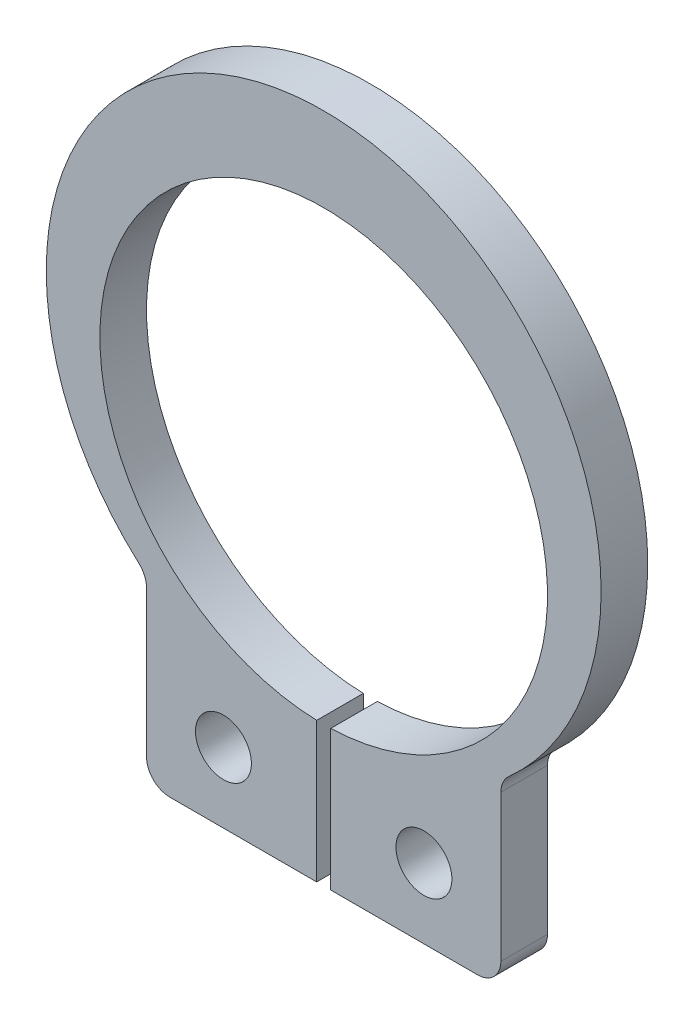
ISO-10303-21;
HEADER;
FILE_DESCRIPTION(('STEP AP214'),'2;1');
FILE_NAME('part.step','',(''),(''),'','','');
FILE_SCHEMA(('AUTOMOTIVE_DESIGN { 1 0 10303 214 1 1 1 1 }'));
ENDSEC;
DATA;
#1=APPLICATION_CONTEXT('core data for automotive mechanical design processes');
#2=APPLICATION_PROTOCOL_DEFINITION('international standard','automotive_design',2000,#1);
#3=PRODUCT_CONTEXT('',#1,'mechanical');
#4=PRODUCT('Part','Part','',(#3));
#5=PRODUCT_RELATED_PRODUCT_CATEGORY('part','',(#4));
#6=PRODUCT_DEFINITION_FORMATION('','',#4);
#7=PRODUCT_DEFINITION_CONTEXT('part definition',#1,'design');
#8=PRODUCT_DEFINITION('design','',#6,#7);
#9=PRODUCT_DEFINITION_SHAPE('','',#8);
#10=(LENGTH_UNIT() NAMED_UNIT(*) SI_UNIT(.MILLI.,.METRE.));
#11=(NAMED_UNIT(*) PLANE_ANGLE_UNIT() SI_UNIT($,.RADIAN.));
#12=(NAMED_UNIT(*) SI_UNIT($,.STERADIAN.) SOLID_ANGLE_UNIT());
#13=UNCERTAINTY_MEASURE_WITH_UNIT(LENGTH_MEASURE(1.E-05),#10,'distance_accuracy_value','');
#14=(GEOMETRIC_REPRESENTATION_CONTEXT(3) GLOBAL_UNCERTAINTY_ASSIGNED_CONTEXT((#13)) GLOBAL_UNIT_ASSIGNED_CONTEXT((#10,
#11,#12)) REPRESENTATION_CONTEXT('',''));
#15=CARTESIAN_POINT('',(0.,0.,0.));
#16=DIRECTION('',(0.,0.,1.));
#17=DIRECTION('',(1.,0.,0.));
#18=AXIS2_PLACEMENT_3D('',#15,#16,#17);
#19=CARTESIAN_POINT('',(4.3,-4.15754615162455,-1.));
#20=DIRECTION('',(0.,0.,1.));
#21=DIRECTION('',(1.,0.,0.));
#22=AXIS2_PLACEMENT_3D('',#19,#20,#21);
#23=CYLINDRICAL_SURFACE('',#22,0.5);
#24=CARTESIAN_POINT('',(4.3,-4.15754615162455,0.));
#25=DIRECTION('',(0.,0.,-1.));
#26=DIRECTION('',(-1.,0.,0.));
#27=AXIS2_PLACEMENT_3D('',#24,#25,#26);
#28=CIRCLE('',#27,0.5);
#29=CARTESIAN_POINT('',(3.8,-4.15754615162455,0.));
#30=VERTEX_POINT('',#29);
#31=CARTESIAN_POINT('',(3.96666666666667,-3.78486815537458,0.));
#32=VERTEX_POINT('',#31);
#33=EDGE_CURVE('E154',#30,#32,#28,.T.);
#34=ORIENTED_EDGE('',*,*,#33,.F.);
#35=DIRECTION('',(0.,0.,1.));
#36=VECTOR('',#35,1.);
#37=CARTESIAN_POINT('',(3.8,-4.15754615162455,-1.));
#38=LINE('',#37,#36);
#39=CARTESIAN_POINT('',(3.8,-4.15754615162455,-1.));
#40=VERTEX_POINT('',#39);
#41=EDGE_CURVE('E11',#40,#30,#38,.T.);
#42=ORIENTED_EDGE('',*,*,#41,.F.);
#43=CARTESIAN_POINT('',(4.3,-4.15754615162455,-1.));
#44=DIRECTION('',(0.,0.,-1.));
#45=DIRECTION('',(-1.,0.,0.));
#46=AXIS2_PLACEMENT_3D('',#43,#44,#45);
#47=CIRCLE('',#46,0.5);
#48=CARTESIAN_POINT('',(3.96666666666667,-3.78486815537458,-1.));
#49=VERTEX_POINT('',#48);
#50=EDGE_CURVE('E187',#40,#49,#47,.T.);
#51=ORIENTED_EDGE('',*,*,#50,.T.);
#52=DIRECTION('',(0.,0.,1.));
#53=VECTOR('',#52,1.);
#54=CARTESIAN_POINT('',(3.96666666666667,-3.78486815537458,-1.));
#55=LINE('',#54,#53);
#56=EDGE_CURVE('E36',#49,#32,#55,.T.);
#57=ORIENTED_EDGE('',*,*,#56,.T.);
#58=EDGE_LOOP('',(#34,#42,#51,#57));
#59=FACE_BOUND('',#58,.T.);
#60=ADVANCED_FACE('F33',(#59),#23,.F.);
#61=CARTESIAN_POINT('',(3.8,-7.3,-1.));
#62=DIRECTION('',(1.,0.,0.));
#63=DIRECTION('',(0.,0.,-1.));
#64=AXIS2_PLACEMENT_3D('',#61,#62,#63);
#65=PLANE('',#64);
#66=DIRECTION('',(0.,1.,0.));
#67=VECTOR('',#66,1.);
#68=CARTESIAN_POINT('',(3.8,-7.3,0.));
#69=LINE('',#68,#67);
#70=CARTESIAN_POINT('',(3.8,-7.3,0.));
#71=VERTEX_POINT('',#70);
#72=EDGE_CURVE('E185',#71,#30,#69,.T.);
#73=ORIENTED_EDGE('',*,*,#72,.F.);
#74=DIRECTION('',(0.,0.,1.));
#75=VECTOR('',#74,1.);
#76=CARTESIAN_POINT('',(3.8,-7.3,-1.));
#77=LINE('',#76,#75);
#78=CARTESIAN_POINT('',(3.8,-7.3,-1.));
#79=VERTEX_POINT('',#78);
#80=EDGE_CURVE('E42',#79,#71,#77,.T.);
#81=ORIENTED_EDGE('',*,*,#80,.F.);
#82=DIRECTION('',(0.,1.,0.));
#83=VECTOR('',#82,1.);
#84=CARTESIAN_POINT('',(3.8,-7.3,-1.));
#85=LINE('',#84,#83);
#86=EDGE_CURVE('E144',#79,#40,#85,.T.);
#87=ORIENTED_EDGE('',*,*,#86,.T.);
#88=ORIENTED_EDGE('',*,*,#41,.T.);
#89=EDGE_LOOP('',(#73,#81,#87,#88));
#90=FACE_BOUND('',#89,.T.);
#91=ADVANCED_FACE('F207',(#90),#65,.T.);
#92=CARTESIAN_POINT('',(3.3,-7.3,-1.));
#93=DIRECTION('',(0.,0.,1.));
#94=DIRECTION('',(1.,0.,0.));
#95=AXIS2_PLACEMENT_3D('',#92,#93,#94);
#96=CYLINDRICAL_SURFACE('',#95,0.5);
#97=CARTESIAN_POINT('',(3.3,-7.3,0.));
#98=DIRECTION('',(0.,0.,1.));
#99=DIRECTION('',(1.,0.,0.));
#100=AXIS2_PLACEMENT_3D('',#97,#98,#99);
#101=CIRCLE('',#100,0.5);
#102=CARTESIAN_POINT('',(3.3,-7.8,0.));
#103=VERTEX_POINT('',#102);
#104=EDGE_CURVE('E131',#103,#71,#101,.T.);
#105=ORIENTED_EDGE('',*,*,#104,.F.);
#106=DIRECTION('',(0.,0.,1.));
#107=VECTOR('',#106,1.);
#108=CARTESIAN_POINT('',(3.3,-7.8,-1.));
#109=LINE('',#108,#107);
#110=CARTESIAN_POINT('',(3.3,-7.8,-1.));
#111=VERTEX_POINT('',#110);
#112=EDGE_CURVE('E126',#111,#103,#109,.T.);
#113=ORIENTED_EDGE('',*,*,#112,.F.);
#114=CARTESIAN_POINT('',(3.3,-7.3,-1.));
#115=DIRECTION('',(0.,0.,1.));
#116=DIRECTION('',(1.,0.,0.));
#117=AXIS2_PLACEMENT_3D('',#114,#115,#116);
#118=CIRCLE('',#117,0.5);
#119=EDGE_CURVE('E129',#111,#79,#118,.T.);
#120=ORIENTED_EDGE('',*,*,#119,.T.);
#121=ORIENTED_EDGE('',*,*,#80,.T.);
#122=EDGE_LOOP('',(#105,#113,#120,#121));
#123=FACE_BOUND('',#122,.T.);
#124=ADVANCED_FACE('F128',(#123),#96,.T.);
#125=CARTESIAN_POINT('',(0.15,-7.8,-1.));
#126=DIRECTION('',(0.,-1.,0.));
#127=DIRECTION('',(0.,0.,-1.));
#128=AXIS2_PLACEMENT_3D('',#125,#126,#127);
#129=PLANE('',#128);
#130=DIRECTION('',(1.,0.,0.));
#131=VECTOR('',#130,1.);
#132=CARTESIAN_POINT('',(0.15,-7.8,0.));
#133=LINE('',#132,#131);
#134=CARTESIAN_POINT('',(0.15,-7.8,0.));
#135=VERTEX_POINT('',#134);
#136=EDGE_CURVE('E182',#135,#103,#133,.T.);
#137=ORIENTED_EDGE('',*,*,#136,.F.);
#138=DIRECTION('',(0.,0.,1.));
#139=VECTOR('',#138,1.);
#140=CARTESIAN_POINT('',(0.15,-7.8,-1.));
#141=LINE('',#140,#139);
#142=CARTESIAN_POINT('',(0.15,-7.8,-1.));
#143=VERTEX_POINT('',#142);
#144=EDGE_CURVE('E136',#143,#135,#141,.T.);
#145=ORIENTED_EDGE('',*,*,#144,.F.);
#146=DIRECTION('',(1.,0.,0.));
#147=VECTOR('',#146,1.);
#148=CARTESIAN_POINT('',(0.15,-7.8,-1.));
#149=LINE('',#148,#147);
#150=EDGE_CURVE('E142',#143,#111,#149,.T.);
#151=ORIENTED_EDGE('',*,*,#150,.T.);
#152=ORIENTED_EDGE('',*,*,#112,.T.);
#153=EDGE_LOOP('',(#137,#145,#151,#152));
#154=FACE_BOUND('',#153,.T.);
#155=ADVANCED_FACE('F146',(#154),#129,.T.);
#156=CARTESIAN_POINT('',(0.15,-4.79765567751584,-1.));
#157=DIRECTION('',(-1.,0.,0.));
#158=DIRECTION('',(0.,-1.,0.));
#159=AXIS2_PLACEMENT_3D('',#156,#157,#158);
#160=PLANE('',#159);
#161=DIRECTION('',(0.,-1.,0.));
#162=VECTOR('',#161,1.);
#163=CARTESIAN_POINT('',(0.15,-4.79765567751584,0.));
#164=LINE('',#163,#162);
#165=CARTESIAN_POINT('',(0.150000000000003,-4.79765567751584,0.));
#166=VERTEX_POINT('',#165);
#167=EDGE_CURVE('E179',#166,#135,#164,.T.);
#168=ORIENTED_EDGE('',*,*,#167,.F.);
#169=DIRECTION('',(0.,0.,1.));
#170=VECTOR('',#169,1.);
#171=CARTESIAN_POINT('',(0.150000000000003,-4.79765567751584,-1.));
#172=LINE('',#171,#170);
#173=CARTESIAN_POINT('',(0.150000000000003,-4.79765567751584,-1.));
#174=VERTEX_POINT('',#173);
#175=EDGE_CURVE('E191',#174,#166,#172,.T.);
#176=ORIENTED_EDGE('',*,*,#175,.F.);
#177=DIRECTION('',(0.,-1.,0.));
#178=VECTOR('',#177,1.);
#179=CARTESIAN_POINT('',(0.15,-4.79765567751584,-1.));
#180=LINE('',#179,#178);
#181=EDGE_CURVE('E147',#174,#143,#180,.T.);
#182=ORIENTED_EDGE('',*,*,#181,.T.);
#183=ORIENTED_EDGE('',*,*,#144,.T.);
#184=EDGE_LOOP('',(#168,#176,#182,#183));
#185=FACE_BOUND('',#184,.T.);
#186=ADVANCED_FACE('F220',(#185),#160,.T.);
#187=CARTESIAN_POINT('',(0.,0.,-1.));
#188=DIRECTION('',(0.,0.,1.));
#189=DIRECTION('',(1.,0.,0.));
#190=AXIS2_PLACEMENT_3D('',#187,#188,#189);
#191=CYLINDRICAL_SURFACE('',#190,4.80000000000002);
#192=CARTESIAN_POINT('',(0.,0.,0.));
#193=DIRECTION('',(0.,0.,-1.));
#194=DIRECTION('',(-1.,0.,0.));
#195=AXIS2_PLACEMENT_3D('',#192,#193,#194);
#196=CIRCLE('',#195,4.80000000000002);
#197=CARTESIAN_POINT('',(-0.15,-4.79765567751584,0.));
#198=VERTEX_POINT('',#197);
#199=EDGE_CURVE('E176',#198,#166,#196,.T.);
#200=ORIENTED_EDGE('',*,*,#199,.F.);
#201=DIRECTION('',(0.,0.,1.));
#202=VECTOR('',#201,1.);
#203=CARTESIAN_POINT('',(-0.15,-4.79765567751584,-1.));
#204=LINE('',#203,#202);
#205=CARTESIAN_POINT('',(-0.15,-4.79765567751584,-1.));
#206=VERTEX_POINT('',#205);
#207=EDGE_CURVE('E193',#206,#198,#204,.T.);
#208=ORIENTED_EDGE('',*,*,#207,.F.);
#209=CARTESIAN_POINT('',(0.,0.,-1.));
#210=DIRECTION('',(0.,0.,-1.));
#211=DIRECTION('',(-1.,0.,0.));
#212=AXIS2_PLACEMENT_3D('',#209,#210,#211);
#213=CIRCLE('',#212,4.80000000000002);
#214=EDGE_CURVE('E149',#206,#174,#213,.T.);
#215=ORIENTED_EDGE('',*,*,#214,.T.);
#216=ORIENTED_EDGE('',*,*,#175,.T.);
#217=EDGE_LOOP('',(#200,#208,#215,#216));
#218=FACE_BOUND('',#217,.T.);
#219=ADVANCED_FACE('F223',(#218),#191,.F.);
#220=CARTESIAN_POINT('',(-0.15,-7.8,-1.));
#221=DIRECTION('',(1.,0.,0.));
#222=DIRECTION('',(0.,1.,0.));
#223=AXIS2_PLACEMENT_3D('',#220,#221,#222);
#224=PLANE('',#223);
#225=DIRECTION('',(0.,1.,0.));
#226=VECTOR('',#225,1.);
#227=CARTESIAN_POINT('',(-0.15,-7.8,0.));
#228=LINE('',#227,#226);
#229=CARTESIAN_POINT('',(-0.15,-7.8,0.));
#230=VERTEX_POINT('',#229);
#231=EDGE_CURVE('E173',#230,#198,#228,.T.);
#232=ORIENTED_EDGE('',*,*,#231,.F.);
#233=DIRECTION('',(0.,0.,1.));
#234=VECTOR('',#233,1.);
#235=CARTESIAN_POINT('',(-0.15,-7.8,-1.));
#236=LINE('',#235,#234);
#237=CARTESIAN_POINT('',(-0.15,-7.8,-1.));
#238=VERTEX_POINT('',#237);
#239=EDGE_CURVE('E195',#238,#230,#236,.T.);
#240=ORIENTED_EDGE('',*,*,#239,.F.);
#241=DIRECTION('',(0.,1.,0.));
#242=VECTOR('',#241,1.);
#243=CARTESIAN_POINT('',(-0.15,-7.8,-1.));
#244=LINE('',#243,#242);
#245=EDGE_CURVE('E297',#238,#206,#244,.T.);
#246=ORIENTED_EDGE('',*,*,#245,.T.);
#247=ORIENTED_EDGE('',*,*,#207,.T.);
#248=EDGE_LOOP('',(#232,#240,#246,#247));
#249=FACE_BOUND('',#248,.T.);
#250=ADVANCED_FACE('F227',(#249),#224,.T.);
#251=CARTESIAN_POINT('',(-3.3,-7.8,-1.));
#252=DIRECTION('',(0.,-1.,0.));
#253=DIRECTION('',(0.,0.,-1.));
#254=AXIS2_PLACEMENT_3D('',#251,#252,#253);
#255=PLANE('',#254);
#256=DIRECTION('',(1.,0.,0.));
#257=VECTOR('',#256,1.);
#258=CARTESIAN_POINT('',(-3.3,-7.8,0.));
#259=LINE('',#258,#257);
#260=CARTESIAN_POINT('',(-3.3,-7.8,0.));
#261=VERTEX_POINT('',#260);
#262=EDGE_CURVE('E170',#261,#230,#259,.T.);
#263=ORIENTED_EDGE('',*,*,#262,.F.);
#264=DIRECTION('',(0.,0.,1.));
#265=VECTOR('',#264,1.);
#266=CARTESIAN_POINT('',(-3.3,-7.8,-1.));
#267=LINE('',#266,#265);
#268=CARTESIAN_POINT('',(-3.3,-7.8,-1.));
#269=VERTEX_POINT('',#268);
#270=EDGE_CURVE('E197',#269,#261,#267,.T.);
#271=ORIENTED_EDGE('',*,*,#270,.F.);
#272=DIRECTION('',(1.,0.,0.));
#273=VECTOR('',#272,1.);
#274=CARTESIAN_POINT('',(-3.3,-7.8,-1.));
#275=LINE('',#274,#273);
#276=EDGE_CURVE('E294',#269,#238,#275,.T.);
#277=ORIENTED_EDGE('',*,*,#276,.T.);
#278=ORIENTED_EDGE('',*,*,#239,.T.);
#279=EDGE_LOOP('',(#263,#271,#277,#278));
#280=FACE_BOUND('',#279,.T.);
#281=ADVANCED_FACE('F231',(#280),#255,.T.);
#282=CARTESIAN_POINT('',(-3.3,-7.3,-1.));
#283=DIRECTION('',(0.,0.,1.));
#284=DIRECTION('',(1.,0.,0.));
#285=AXIS2_PLACEMENT_3D('',#282,#283,#284);
#286=CYLINDRICAL_SURFACE('',#285,0.5);
#287=CARTESIAN_POINT('',(-3.3,-7.3,0.));
#288=DIRECTION('',(0.,0.,1.));
#289=DIRECTION('',(1.,0.,0.));
#290=AXIS2_PLACEMENT_3D('',#287,#288,#289);
#291=CIRCLE('',#290,0.5);
#292=CARTESIAN_POINT('',(-3.8,-7.3,0.));
#293=VERTEX_POINT('',#292);
#294=EDGE_CURVE('E167',#293,#261,#291,.T.);
#295=ORIENTED_EDGE('',*,*,#294,.F.);
#296=DIRECTION('',(0.,0.,1.));
#297=VECTOR('',#296,1.);
#298=CARTESIAN_POINT('',(-3.8,-7.3,-1.));
#299=LINE('',#298,#297);
#300=CARTESIAN_POINT('',(-3.8,-7.3,-1.));
#301=VERTEX_POINT('',#300);
#302=EDGE_CURVE('E199',#301,#293,#299,.T.);
#303=ORIENTED_EDGE('',*,*,#302,.F.);
#304=CARTESIAN_POINT('',(-3.3,-7.3,-1.));
#305=DIRECTION('',(0.,0.,1.));
#306=DIRECTION('',(1.,0.,0.));
#307=AXIS2_PLACEMENT_3D('',#304,#305,#306);
#308=CIRCLE('',#307,0.5);
#309=EDGE_CURVE('E291',#301,#269,#308,.T.);
#310=ORIENTED_EDGE('',*,*,#309,.T.);
#311=ORIENTED_EDGE('',*,*,#270,.T.);
#312=EDGE_LOOP('',(#295,#303,#310,#311));
#313=FACE_BOUND('',#312,.T.);
#314=ADVANCED_FACE('F235',(#313),#286,.T.);
#315=CARTESIAN_POINT('',(-3.8,-4.15754615162455,-1.));
#316=DIRECTION('',(-1.,0.,0.));
#317=DIRECTION('',(0.,0.,1.));
#318=AXIS2_PLACEMENT_3D('',#315,#316,#317);
#319=PLANE('',#318);
#320=DIRECTION('',(0.,-1.,0.));
#321=VECTOR('',#320,1.);
#322=CARTESIAN_POINT('',(-3.8,-4.15754615162455,0.));
#323=LINE('',#322,#321);
#324=CARTESIAN_POINT('',(-3.8,-4.15754615162455,0.));
#325=VERTEX_POINT('',#324);
#326=EDGE_CURVE('E164',#325,#293,#323,.T.);
#327=ORIENTED_EDGE('',*,*,#326,.F.);
#328=DIRECTION('',(0.,0.,1.));
#329=VECTOR('',#328,1.);
#330=CARTESIAN_POINT('',(-3.8,-4.15754615162455,-1.));
#331=LINE('',#330,#329);
#332=CARTESIAN_POINT('',(-3.8,-4.15754615162455,-1.));
#333=VERTEX_POINT('',#332);
#334=EDGE_CURVE('E201',#333,#325,#331,.T.);
#335=ORIENTED_EDGE('',*,*,#334,.F.);
#336=DIRECTION('',(0.,-1.,0.));
#337=VECTOR('',#336,1.);
#338=CARTESIAN_POINT('',(-3.8,-4.15754615162455,-1.));
#339=LINE('',#338,#337);
#340=EDGE_CURVE('E288',#333,#301,#339,.T.);
#341=ORIENTED_EDGE('',*,*,#340,.T.);
#342=ORIENTED_EDGE('',*,*,#302,.T.);
#343=EDGE_LOOP('',(#327,#335,#341,#342));
#344=FACE_BOUND('',#343,.T.);
#345=ADVANCED_FACE('F239',(#344),#319,.T.);
#346=CARTESIAN_POINT('',(-4.3,-4.15754615162455,-1.));
#347=DIRECTION('',(0.,0.,1.));
#348=DIRECTION('',(1.,0.,0.));
#349=AXIS2_PLACEMENT_3D('',#346,#347,#348);
#350=CYLINDRICAL_SURFACE('',#349,0.5);
#351=CARTESIAN_POINT('',(-4.3,-4.15754615162455,0.));
#352=DIRECTION('',(0.,0.,-1.));
#353=DIRECTION('',(-1.,0.,0.));
#354=AXIS2_PLACEMENT_3D('',#351,#352,#353);
#355=CIRCLE('',#354,0.5);
#356=CARTESIAN_POINT('',(-3.96666666666667,-3.78486815537458,0.));
#357=VERTEX_POINT('',#356);
#358=EDGE_CURVE('E161',#357,#325,#355,.T.);
#359=ORIENTED_EDGE('',*,*,#358,.F.);
#360=DIRECTION('',(0.,0.,1.));
#361=VECTOR('',#360,1.);
#362=CARTESIAN_POINT('',(-3.96666666666667,-3.78486815537458,-1.));
#363=LINE('',#362,#361);
#364=CARTESIAN_POINT('',(-3.96666666666667,-3.78486815537458,-1.));
#365=VERTEX_POINT('',#364);
#366=EDGE_CURVE('E202',#365,#357,#363,.T.);
#367=ORIENTED_EDGE('',*,*,#366,.F.);
#368=CARTESIAN_POINT('',(-4.3,-4.15754615162455,-1.));
#369=DIRECTION('',(0.,0.,-1.));
#370=DIRECTION('',(-1.,0.,0.));
#371=AXIS2_PLACEMENT_3D('',#368,#369,#370);
#372=CIRCLE('',#371,0.5);
#373=EDGE_CURVE('E285',#365,#333,#372,.T.);
#374=ORIENTED_EDGE('',*,*,#373,.T.);
#375=ORIENTED_EDGE('',*,*,#334,.T.);
#376=EDGE_LOOP('',(#359,#367,#374,#375));
#377=FACE_BOUND('',#376,.T.);
#378=ADVANCED_FACE('F243',(#377),#350,.F.);
#379=CARTESIAN_POINT('',(0.,0.65,-1.));
#380=DIRECTION('',(0.,0.,1.));
#381=DIRECTION('',(1.,0.,0.));
#382=AXIS2_PLACEMENT_3D('',#379,#380,#381);
#383=CYLINDRICAL_SURFACE('',#382,5.95);
#384=CARTESIAN_POINT('',(0.,0.65,0.));
#385=DIRECTION('',(0.,0.,1.));
#386=DIRECTION('',(1.,0.,0.));
#387=AXIS2_PLACEMENT_3D('',#384,#385,#386);
#388=CIRCLE('',#387,5.95);
#389=EDGE_CURVE('E157',#32,#357,#388,.T.);
#390=ORIENTED_EDGE('',*,*,#389,.F.);
#391=ORIENTED_EDGE('',*,*,#56,.F.);
#392=CARTESIAN_POINT('',(0.,0.65,-1.));
#393=DIRECTION('',(0.,0.,1.));
#394=DIRECTION('',(1.,0.,0.));
#395=AXIS2_PLACEMENT_3D('',#392,#393,#394);
#396=CIRCLE('',#395,5.95);
#397=EDGE_CURVE('E283',#49,#365,#396,.T.);
#398=ORIENTED_EDGE('',*,*,#397,.T.);
#399=ORIENTED_EDGE('',*,*,#366,.T.);
#400=EDGE_LOOP('',(#390,#391,#398,#399));
#401=FACE_BOUND('',#400,.T.);
#402=ADVANCED_FACE('F204',(#401),#383,.T.);
#403=CARTESIAN_POINT('',(4.3,-4.15754615162455,-1.));
#404=DIRECTION('',(0.,0.,-1.));
#405=DIRECTION('',(-1.,0.,0.));
#406=AXIS2_PLACEMENT_3D('',#403,#404,#405);
#407=PLANE('',#406);
#408=CARTESIAN_POINT('',(2.15,-6.3,-1.));
#409=DIRECTION('',(0.,0.,1.));
#410=DIRECTION('',(1.,0.,0.));
#411=AXIS2_PLACEMENT_3D('',#408,#409,#410);
#412=CIRCLE('',#411,0.6);
#413=CARTESIAN_POINT('',(2.75,-6.3,-1.));
#414=VERTEX_POINT('',#413);
#415=EDGE_CURVE('E270',#414,#414,#412,.T.);
#416=ORIENTED_EDGE('',*,*,#415,.T.);
#417=EDGE_LOOP('',(#416));
#418=FACE_BOUND('',#417,.T.);
#419=CARTESIAN_POINT('',(-2.15,-6.3,-1.));
#420=DIRECTION('',(0.,0.,1.));
#421=DIRECTION('',(1.,0.,0.));
#422=AXIS2_PLACEMENT_3D('',#419,#420,#421);
#423=CIRCLE('',#422,0.6);
#424=CARTESIAN_POINT('',(-1.55,-6.3,-1.));
#425=VERTEX_POINT('',#424);
#426=EDGE_CURVE('E158',#425,#425,#423,.T.);
#427=ORIENTED_EDGE('',*,*,#426,.T.);
#428=EDGE_LOOP('',(#427));
#429=FACE_BOUND('',#428,.T.);
#430=ORIENTED_EDGE('',*,*,#50,.F.);
#431=ORIENTED_EDGE('',*,*,#86,.F.);
#432=ORIENTED_EDGE('',*,*,#119,.F.);
#433=ORIENTED_EDGE('',*,*,#150,.F.);
#434=ORIENTED_EDGE('',*,*,#181,.F.);
#435=ORIENTED_EDGE('',*,*,#214,.F.);
#436=ORIENTED_EDGE('',*,*,#245,.F.);
#437=ORIENTED_EDGE('',*,*,#276,.F.);
#438=ORIENTED_EDGE('',*,*,#309,.F.);
#439=ORIENTED_EDGE('',*,*,#340,.F.);
#440=ORIENTED_EDGE('',*,*,#373,.F.);
#441=ORIENTED_EDGE('',*,*,#397,.F.);
#442=EDGE_LOOP('',(#430,#431,#432,#433,#434,#435,#436,#437,#438,#439,#440,#441));
#443=FACE_BOUND('',#442,.T.);
#444=ADVANCED_FACE('F140',(#418,#429,#443),#407,.T.);
#445=CARTESIAN_POINT('',(4.3,-4.15754615162455,0.));
#446=DIRECTION('',(0.,0.,-1.));
#447=DIRECTION('',(-1.,0.,0.));
#448=AXIS2_PLACEMENT_3D('',#445,#446,#447);
#449=PLANE('',#448);
#450=CARTESIAN_POINT('',(2.15,-6.3,0.));
#451=DIRECTION('',(0.,0.,1.));
#452=DIRECTION('',(1.,0.,0.));
#453=AXIS2_PLACEMENT_3D('',#450,#451,#452);
#454=CIRCLE('',#453,0.6);
#455=CARTESIAN_POINT('',(2.75,-6.3,0.));
#456=VERTEX_POINT('',#455);
#457=EDGE_CURVE('E273',#456,#456,#454,.T.);
#458=ORIENTED_EDGE('',*,*,#457,.F.);
#459=EDGE_LOOP('',(#458));
#460=FACE_BOUND('',#459,.T.);
#461=CARTESIAN_POINT('',(-2.15,-6.3,0.));
#462=DIRECTION('',(0.,0.,1.));
#463=DIRECTION('',(1.,0.,0.));
#464=AXIS2_PLACEMENT_3D('',#461,#462,#463);
#465=CIRCLE('',#464,0.6);
#466=CARTESIAN_POINT('',(-1.55,-6.3,0.));
#467=VERTEX_POINT('',#466);
#468=EDGE_CURVE('E275',#467,#467,#465,.T.);
#469=ORIENTED_EDGE('',*,*,#468,.F.);
#470=EDGE_LOOP('',(#469));
#471=FACE_BOUND('',#470,.T.);
#472=ORIENTED_EDGE('',*,*,#33,.T.);
#473=ORIENTED_EDGE('',*,*,#389,.T.);
#474=ORIENTED_EDGE('',*,*,#358,.T.);
#475=ORIENTED_EDGE('',*,*,#326,.T.);
#476=ORIENTED_EDGE('',*,*,#294,.T.);
#477=ORIENTED_EDGE('',*,*,#262,.T.);
#478=ORIENTED_EDGE('',*,*,#231,.T.);
#479=ORIENTED_EDGE('',*,*,#199,.T.);
#480=ORIENTED_EDGE('',*,*,#167,.T.);
#481=ORIENTED_EDGE('',*,*,#136,.T.);
#482=ORIENTED_EDGE('',*,*,#104,.T.);
#483=ORIENTED_EDGE('',*,*,#72,.T.);
#484=EDGE_LOOP('',(#472,#473,#474,#475,#476,#477,#478,#479,#480,#481,#482,#483));
#485=FACE_BOUND('',#484,.T.);
#486=ADVANCED_FACE('F206',(#460,#471,#485),#449,.F.);
#487=CARTESIAN_POINT('',(-2.15,-6.3,-1.));
#488=DIRECTION('',(0.,0.,1.));
#489=DIRECTION('',(1.,0.,0.));
#490=AXIS2_PLACEMENT_3D('',#487,#488,#489);
#491=CYLINDRICAL_SURFACE('',#490,0.6);
#492=ORIENTED_EDGE('',*,*,#426,.F.);
#493=EDGE_LOOP('',(#492));
#494=FACE_BOUND('',#493,.T.);
#495=ORIENTED_EDGE('',*,*,#468,.T.);
#496=EDGE_LOOP('',(#495));
#497=FACE_BOUND('',#496,.T.);
#498=ADVANCED_FACE('F255',(#494,#497),#491,.F.);
#499=CARTESIAN_POINT('',(2.15,-6.3,-1.));
#500=DIRECTION('',(0.,0.,1.));
#501=DIRECTION('',(1.,0.,0.));
#502=AXIS2_PLACEMENT_3D('',#499,#500,#501);
#503=CYLINDRICAL_SURFACE('',#502,0.6);
#504=ORIENTED_EDGE('',*,*,#415,.F.);
#505=EDGE_LOOP('',(#504));
#506=FACE_BOUND('',#505,.T.);
#507=ORIENTED_EDGE('',*,*,#457,.T.);
#508=EDGE_LOOP('',(#507));
#509=FACE_BOUND('',#508,.T.);
#510=ADVANCED_FACE('F262',(#506,#509),#503,.F.);
#511=CLOSED_SHELL('',(#60,#91,#124,#155,#186,#219,#250,#281,#314,#345,#378,#402,#444,#486,#498,#510));
#512=MANIFOLD_SOLID_BREP('B2',#511);
#513=ADVANCED_BREP_SHAPE_REPRESENTATION('',(#18,#512),#14);
#514=SHAPE_DEFINITION_REPRESENTATION(#9,#513);
ENDSEC;
END-ISO-10303-21;
